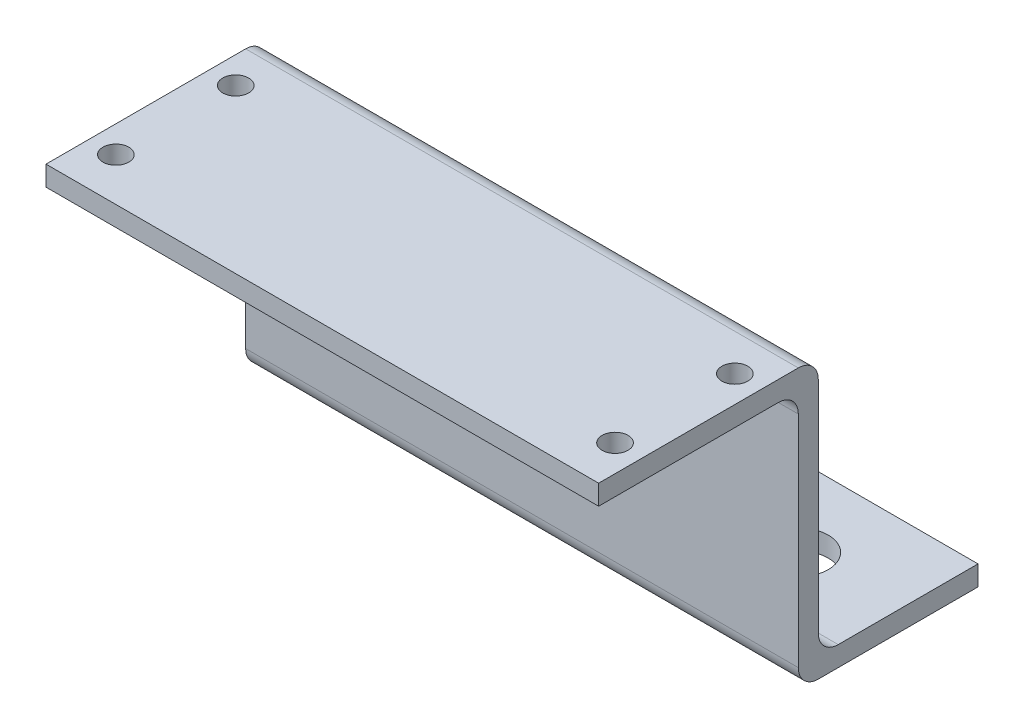
ISO-10303-21;
HEADER;
FILE_DESCRIPTION(('STEP AP214'),'2;1');
FILE_NAME('part.step','',(''),(''),'','','');
FILE_SCHEMA(('AUTOMOTIVE_DESIGN { 1 0 10303 214 1 1 1 1 }'));
ENDSEC;
DATA;
#1=APPLICATION_CONTEXT('core data for automotive mechanical design processes');
#2=APPLICATION_PROTOCOL_DEFINITION('international standard','automotive_design',2000,#1);
#3=PRODUCT_CONTEXT('',#1,'mechanical');
#4=PRODUCT('Part','Part','',(#3));
#5=PRODUCT_RELATED_PRODUCT_CATEGORY('part','',(#4));
#6=PRODUCT_DEFINITION_FORMATION('','',#4);
#7=PRODUCT_DEFINITION_CONTEXT('part definition',#1,'design');
#8=PRODUCT_DEFINITION('design','',#6,#7);
#9=PRODUCT_DEFINITION_SHAPE('','',#8);
#10=(LENGTH_UNIT() NAMED_UNIT(*) SI_UNIT(.MILLI.,.METRE.));
#11=(NAMED_UNIT(*) PLANE_ANGLE_UNIT() SI_UNIT($,.RADIAN.));
#12=(NAMED_UNIT(*) SI_UNIT($,.STERADIAN.) SOLID_ANGLE_UNIT());
#13=UNCERTAINTY_MEASURE_WITH_UNIT(LENGTH_MEASURE(1.E-05),#10,'distance_accuracy_value','');
#14=(GEOMETRIC_REPRESENTATION_CONTEXT(3) GLOBAL_UNCERTAINTY_ASSIGNED_CONTEXT((#13)) GLOBAL_UNIT_ASSIGNED_CONTEXT((#10,
#11,#12)) REPRESENTATION_CONTEXT('',''));
#15=CARTESIAN_POINT('',(0.,0.,0.));
#16=DIRECTION('',(0.,0.,1.));
#17=DIRECTION('',(1.,0.,0.));
#18=AXIS2_PLACEMENT_3D('',#15,#16,#17);
#19=CARTESIAN_POINT('',(-9.,14.,-11.6776695296523));
#20=DIRECTION('',(0.,0.,1.));
#21=DIRECTION('',(1.,0.,0.));
#22=AXIS2_PLACEMENT_3D('',#19,#20,#21);
#23=CYLINDRICAL_SURFACE('',#22,4.);
#24=CARTESIAN_POINT('',(-9.,14.,-7.67766952965229));
#25=DIRECTION('',(0.,0.,1.));
#26=DIRECTION('',(1.,0.,0.));
#27=AXIS2_PLACEMENT_3D('',#24,#25,#26);
#28=CIRCLE('',#27,4.);
#29=CARTESIAN_POINT('',(-5.,14.,-7.67766952965229));
#30=VERTEX_POINT('',#29);
#31=EDGE_CURVE('E182',#30,#30,#28,.T.);
#32=ORIENTED_EDGE('',*,*,#31,.T.);
#33=EDGE_LOOP('',(#32));
#34=FACE_BOUND('',#33,.T.);
#35=CARTESIAN_POINT('',(-9.,14.,-9.67766952965229));
#36=DIRECTION('',(0.,0.,-1.));
#37=DIRECTION('',(-1.,0.,0.));
#38=AXIS2_PLACEMENT_3D('',#35,#36,#37);
#39=CIRCLE('',#38,4.);
#40=CARTESIAN_POINT('',(-13.,14.,-9.67766952965229));
#41=VERTEX_POINT('',#40);
#42=EDGE_CURVE('E176',#41,#41,#39,.F.);
#43=ORIENTED_EDGE('',*,*,#42,.F.);
#44=EDGE_LOOP('',(#43));
#45=FACE_BOUND('',#44,.T.);
#46=ADVANCED_FACE('F43',(#34,#45),#23,.F.);
#47=CARTESIAN_POINT('',(9.,14.,-11.6776695296523));
#48=DIRECTION('',(0.,0.,1.));
#49=DIRECTION('',(1.,0.,0.));
#50=AXIS2_PLACEMENT_3D('',#47,#48,#49);
#51=CYLINDRICAL_SURFACE('',#50,4.);
#52=CARTESIAN_POINT('',(9.,14.,-7.67766952965229));
#53=DIRECTION('',(0.,0.,1.));
#54=DIRECTION('',(1.,0.,0.));
#55=AXIS2_PLACEMENT_3D('',#52,#53,#54);
#56=CIRCLE('',#55,4.);
#57=CARTESIAN_POINT('',(13.,14.,-7.67766952965229));
#58=VERTEX_POINT('',#57);
#59=EDGE_CURVE('E179',#58,#58,#56,.T.);
#60=ORIENTED_EDGE('',*,*,#59,.T.);
#61=EDGE_LOOP('',(#60));
#62=FACE_BOUND('',#61,.T.);
#63=CARTESIAN_POINT('',(9.,14.,-9.67766952965229));
#64=DIRECTION('',(0.,0.,-1.));
#65=DIRECTION('',(-1.,0.,0.));
#66=AXIS2_PLACEMENT_3D('',#63,#64,#65);
#67=CIRCLE('',#66,4.);
#68=CARTESIAN_POINT('',(5.,14.,-9.67766952965229));
#69=VERTEX_POINT('',#68);
#70=EDGE_CURVE('E175',#69,#69,#67,.T.);
#71=ORIENTED_EDGE('',*,*,#70,.T.);
#72=EDGE_LOOP('',(#71));
#73=FACE_BOUND('',#72,.T.);
#74=ADVANCED_FACE('F284',(#62,#73),#51,.F.);
#75=CARTESIAN_POINT('',(0.,2.,0.));
#76=DIRECTION('',(0.,-1.,0.));
#77=DIRECTION('',(0.,0.,-1.));
#78=AXIS2_PLACEMENT_3D('',#75,#76,#77);
#79=PLANE('',#78);
#80=DIRECTION('',(0.,0.,1.));
#81=VECTOR('',#80,1.);
#82=CARTESIAN_POINT('',(-27.6776695296838,2.,-9.67766952965229));
#83=LINE('',#82,#81);
#84=CARTESIAN_POINT('',(-27.6776695296838,2.,-25.6776695296523));
#85=VERTEX_POINT('',#84);
#86=CARTESIAN_POINT('',(-27.6776695296838,2.,-11.6776695296523));
#87=VERTEX_POINT('',#86);
#88=EDGE_CURVE('E206',#85,#87,#83,.T.);
#89=ORIENTED_EDGE('',*,*,#88,.T.);
#90=DIRECTION('',(1.,0.,0.));
#91=VECTOR('',#90,1.);
#92=CARTESIAN_POINT('',(0.,2.,-11.6776695296523));
#93=LINE('',#92,#91);
#94=CARTESIAN_POINT('',(27.6776695296893,2.,-11.6776695296523));
#95=VERTEX_POINT('',#94);
#96=EDGE_CURVE('E252',#87,#95,#93,.T.);
#97=ORIENTED_EDGE('',*,*,#96,.T.);
#98=DIRECTION('',(0.,0.,-1.));
#99=VECTOR('',#98,1.);
#100=CARTESIAN_POINT('',(27.6776695296893,2.,-25.6776695296523));
#101=LINE('',#100,#99);
#102=CARTESIAN_POINT('',(27.6776695296893,2.,-25.6776695296523));
#103=VERTEX_POINT('',#102);
#104=EDGE_CURVE('E210',#95,#103,#101,.T.);
#105=ORIENTED_EDGE('',*,*,#104,.T.);
#106=DIRECTION('',(-1.,0.,0.));
#107=VECTOR('',#106,1.);
#108=CARTESIAN_POINT('',(-27.6776695296838,2.,-25.6776695296523));
#109=LINE('',#108,#107);
#110=EDGE_CURVE('E203',#103,#85,#109,.T.);
#111=ORIENTED_EDGE('',*,*,#110,.T.);
#112=EDGE_LOOP('',(#89,#97,#105,#111));
#113=FACE_BOUND('',#112,.T.);
#114=CARTESIAN_POINT('',(-17.6776695296838,2.,-17.6776695296436));
#115=DIRECTION('',(0.,1.,0.));
#116=DIRECTION('',(0.,0.,1.));
#117=AXIS2_PLACEMENT_3D('',#114,#115,#116);
#118=CIRCLE('',#117,3.);
#119=CARTESIAN_POINT('',(-17.6776695296838,2.,-14.6776695296436));
#120=VERTEX_POINT('',#119);
#121=EDGE_CURVE('E197',#120,#120,#118,.T.);
#122=ORIENTED_EDGE('',*,*,#121,.F.);
#123=EDGE_LOOP('',(#122));
#124=FACE_BOUND('',#123,.T.);
#125=CARTESIAN_POINT('',(17.6776695296893,2.,-17.6776695296523));
#126=DIRECTION('',(0.,1.,0.));
#127=DIRECTION('',(0.,0.,1.));
#128=AXIS2_PLACEMENT_3D('',#125,#126,#127);
#129=CIRCLE('',#128,3.);
#130=CARTESIAN_POINT('',(17.6776695296893,2.,-14.6776695296523));
#131=VERTEX_POINT('',#130);
#132=EDGE_CURVE('E191',#131,#131,#129,.T.);
#133=ORIENTED_EDGE('',*,*,#132,.F.);
#134=EDGE_LOOP('',(#133));
#135=FACE_BOUND('',#134,.T.);
#136=ADVANCED_FACE('F257',(#113,#124,#135),#79,.F.);
#137=CARTESIAN_POINT('',(0.,0.,0.));
#138=DIRECTION('',(0.,-1.,0.));
#139=DIRECTION('',(0.,0.,-1.));
#140=AXIS2_PLACEMENT_3D('',#137,#138,#139);
#141=PLANE('',#140);
#142=CARTESIAN_POINT('',(-17.6776695296838,0.,-17.6776695296436));
#143=DIRECTION('',(0.,1.,0.));
#144=DIRECTION('',(0.,0.,1.));
#145=AXIS2_PLACEMENT_3D('',#142,#143,#144);
#146=CIRCLE('',#145,3.);
#147=CARTESIAN_POINT('',(-17.6776695296838,0.,-14.6776695296436));
#148=VERTEX_POINT('',#147);
#149=EDGE_CURVE('E194',#148,#148,#146,.T.);
#150=ORIENTED_EDGE('',*,*,#149,.T.);
#151=EDGE_LOOP('',(#150));
#152=FACE_BOUND('',#151,.T.);
#153=DIRECTION('',(0.,0.,-1.));
#154=VECTOR('',#153,1.);
#155=CARTESIAN_POINT('',(27.6776695296893,0.,-25.6776695296523));
#156=LINE('',#155,#154);
#157=CARTESIAN_POINT('',(27.6776695296893,0.,-9.67766952965229));
#158=VERTEX_POINT('',#157);
#159=CARTESIAN_POINT('',(27.6776695296893,0.,-25.6776695296523));
#160=VERTEX_POINT('',#159);
#161=EDGE_CURVE('E215',#158,#160,#156,.T.);
#162=ORIENTED_EDGE('',*,*,#161,.F.);
#163=DIRECTION('',(1.,0.,0.));
#164=VECTOR('',#163,1.);
#165=CARTESIAN_POINT('',(0.,0.,-9.67766952965229));
#166=LINE('',#165,#164);
#167=CARTESIAN_POINT('',(-27.6776695296838,0.,-9.67766952965229));
#168=VERTEX_POINT('',#167);
#169=EDGE_CURVE('E230',#158,#168,#166,.F.);
#170=ORIENTED_EDGE('',*,*,#169,.T.);
#171=DIRECTION('',(0.,0.,1.));
#172=VECTOR('',#171,1.);
#173=CARTESIAN_POINT('',(-27.6776695296838,0.,-9.67766952965229));
#174=LINE('',#173,#172);
#175=CARTESIAN_POINT('',(-27.6776695296838,0.,-25.6776695296523));
#176=VERTEX_POINT('',#175);
#177=EDGE_CURVE('E200',#176,#168,#174,.T.);
#178=ORIENTED_EDGE('',*,*,#177,.F.);
#179=DIRECTION('',(-1.,0.,0.));
#180=VECTOR('',#179,1.);
#181=CARTESIAN_POINT('',(17.6776695296893,0.,-25.6776695296523));
#182=LINE('',#181,#180);
#183=EDGE_CURVE('E207',#160,#176,#182,.T.);
#184=ORIENTED_EDGE('',*,*,#183,.F.);
#185=EDGE_LOOP('',(#162,#170,#178,#184));
#186=FACE_BOUND('',#185,.T.);
#187=CARTESIAN_POINT('',(17.6776695296893,0.,-17.6776695296523));
#188=DIRECTION('',(0.,1.,0.));
#189=DIRECTION('',(0.,0.,1.));
#190=AXIS2_PLACEMENT_3D('',#187,#188,#189);
#191=CIRCLE('',#190,3.);
#192=CARTESIAN_POINT('',(17.6776695296893,0.,-14.6776695296523));
#193=VERTEX_POINT('',#192);
#194=EDGE_CURVE('E190',#193,#193,#191,.T.);
#195=ORIENTED_EDGE('',*,*,#194,.T.);
#196=EDGE_LOOP('',(#195));
#197=FACE_BOUND('',#196,.T.);
#198=ADVANCED_FACE('F271',(#152,#186,#197),#141,.T.);
#199=CARTESIAN_POINT('',(-27.6776695296838,2.,-9.67766952965229));
#200=DIRECTION('',(1.,0.,0.));
#201=DIRECTION('',(0.,0.,-1.));
#202=AXIS2_PLACEMENT_3D('',#199,#200,#201);
#203=PLANE('',#202);
#204=DIRECTION('',(0.,0.,-1.));
#205=VECTOR('',#204,1.);
#206=CARTESIAN_POINT('',(-27.6776695296838,28.,12.3223304703477));
#207=LINE('',#206,#205);
#208=CARTESIAN_POINT('',(-27.6776695296838,28.,12.3223304703477));
#209=VERTEX_POINT('',#208);
#210=CARTESIAN_POINT('',(-27.6776695296838,28.,-7.67766952965229));
#211=VERTEX_POINT('',#210);
#212=EDGE_CURVE('E141',#209,#211,#207,.T.);
#213=ORIENTED_EDGE('',*,*,#212,.T.);
#214=CARTESIAN_POINT('',(-27.6776695296838,26.,-7.67766952965229));
#215=DIRECTION('',(1.,0.,0.));
#216=DIRECTION('',(0.,0.,-1.));
#217=AXIS2_PLACEMENT_3D('',#214,#215,#216);
#218=CIRCLE('',#217,2.);
#219=CARTESIAN_POINT('',(-27.6776695296838,26.,-9.67766952965229));
#220=VERTEX_POINT('',#219);
#221=EDGE_CURVE('E242',#211,#220,#218,.F.);
#222=ORIENTED_EDGE('',*,*,#221,.T.);
#223=DIRECTION('',(0.,-1.,0.));
#224=VECTOR('',#223,1.);
#225=CARTESIAN_POINT('',(-27.6776695296838,2.,-9.67766952965229));
#226=LINE('',#225,#224);
#227=CARTESIAN_POINT('',(-27.6776695296838,4.,-9.67766952965229));
#228=VERTEX_POINT('',#227);
#229=EDGE_CURVE('E167',#220,#228,#226,.T.);
#230=ORIENTED_EDGE('',*,*,#229,.T.);
#231=CARTESIAN_POINT('',(-27.6776695296838,4.,-11.6776695296523));
#232=DIRECTION('',(1.,0.,0.));
#233=DIRECTION('',(0.,0.,-1.));
#234=AXIS2_PLACEMENT_3D('',#231,#232,#233);
#235=CIRCLE('',#234,2.);
#236=EDGE_CURVE('E11',#228,#87,#235,.T.);
#237=ORIENTED_EDGE('',*,*,#236,.T.);
#238=ORIENTED_EDGE('',*,*,#88,.F.);
#239=DIRECTION('',(0.,-1.,0.));
#240=VECTOR('',#239,1.);
#241=CARTESIAN_POINT('',(-27.6776695296838,2.,-25.6776695296523));
#242=LINE('',#241,#240);
#243=EDGE_CURVE('E220',#85,#176,#242,.T.);
#244=ORIENTED_EDGE('',*,*,#243,.T.);
#245=ORIENTED_EDGE('',*,*,#177,.T.);
#246=CARTESIAN_POINT('',(-27.6776695296838,2.,-9.67766952965229));
#247=DIRECTION('',(1.,0.,0.));
#248=DIRECTION('',(0.,0.,-1.));
#249=AXIS2_PLACEMENT_3D('',#246,#247,#248);
#250=CIRCLE('',#249,2.);
#251=CARTESIAN_POINT('',(-27.6776695296838,2.,-7.67766952965229));
#252=VERTEX_POINT('',#251);
#253=EDGE_CURVE('E232',#168,#252,#250,.F.);
#254=ORIENTED_EDGE('',*,*,#253,.T.);
#255=DIRECTION('',(0.,-1.,0.));
#256=VECTOR('',#255,1.);
#257=CARTESIAN_POINT('',(-27.6776695296838,26.,-7.67766952965229));
#258=LINE('',#257,#256);
#259=CARTESIAN_POINT('',(-27.6776695296838,24.,-7.67766952965229));
#260=VERTEX_POINT('',#259);
#261=EDGE_CURVE('E185',#260,#252,#258,.T.);
#262=ORIENTED_EDGE('',*,*,#261,.F.);
#263=CARTESIAN_POINT('',(-27.6776695296838,24.,-5.67766952965229));
#264=DIRECTION('',(1.,0.,0.));
#265=DIRECTION('',(0.,0.,-1.));
#266=AXIS2_PLACEMENT_3D('',#263,#264,#265);
#267=CIRCLE('',#266,2.);
#268=CARTESIAN_POINT('',(-27.6776695296838,26.,-5.67766952965229));
#269=VERTEX_POINT('',#268);
#270=EDGE_CURVE('E137',#260,#269,#267,.T.);
#271=ORIENTED_EDGE('',*,*,#270,.T.);
#272=DIRECTION('',(0.,0.,-1.));
#273=VECTOR('',#272,1.);
#274=CARTESIAN_POINT('',(-27.6776695296838,26.,12.3223304703477));
#275=LINE('',#274,#273);
#276=CARTESIAN_POINT('',(-27.6776695296838,26.,12.3223304703477));
#277=VERTEX_POINT('',#276);
#278=EDGE_CURVE('E131',#277,#269,#275,.T.);
#279=ORIENTED_EDGE('',*,*,#278,.F.);
#280=DIRECTION('',(0.,1.,0.));
#281=VECTOR('',#280,1.);
#282=CARTESIAN_POINT('',(-27.6776695296838,26.,12.3223304703477));
#283=LINE('',#282,#281);
#284=EDGE_CURVE('E135',#277,#209,#283,.T.);
#285=ORIENTED_EDGE('',*,*,#284,.T.);
#286=EDGE_LOOP('',(#213,#222,#230,#237,#238,#244,#245,#254,#262,#271,#279,#285));
#287=FACE_BOUND('',#286,.T.);
#288=ADVANCED_FACE('F134',(#287),#203,.F.);
#289=CARTESIAN_POINT('',(27.6776695296893,2.,-25.6776695296523));
#290=DIRECTION('',(-1.,0.,0.));
#291=DIRECTION('',(0.,0.,1.));
#292=AXIS2_PLACEMENT_3D('',#289,#290,#291);
#293=PLANE('',#292);
#294=ORIENTED_EDGE('',*,*,#104,.F.);
#295=CARTESIAN_POINT('',(27.6776695296893,4.,-11.6776695296523));
#296=DIRECTION('',(-1.,0.,0.));
#297=DIRECTION('',(0.,0.,1.));
#298=AXIS2_PLACEMENT_3D('',#295,#296,#297);
#299=CIRCLE('',#298,2.);
#300=CARTESIAN_POINT('',(27.6776695296893,4.,-9.67766952965229));
#301=VERTEX_POINT('',#300);
#302=EDGE_CURVE('E51',#95,#301,#299,.T.);
#303=ORIENTED_EDGE('',*,*,#302,.T.);
#304=DIRECTION('',(0.,1.,0.));
#305=VECTOR('',#304,1.);
#306=CARTESIAN_POINT('',(27.6776695296893,26.,-9.67766952965229));
#307=LINE('',#306,#305);
#308=CARTESIAN_POINT('',(27.6776695296893,26.,-9.67766952965229));
#309=VERTEX_POINT('',#308);
#310=EDGE_CURVE('E173',#301,#309,#307,.T.);
#311=ORIENTED_EDGE('',*,*,#310,.T.);
#312=CARTESIAN_POINT('',(27.6776695296893,26.,-7.67766952965229));
#313=DIRECTION('',(-1.,0.,0.));
#314=DIRECTION('',(0.,0.,1.));
#315=AXIS2_PLACEMENT_3D('',#312,#313,#314);
#316=CIRCLE('',#315,2.);
#317=CARTESIAN_POINT('',(27.6776695296893,28.,-7.67766952965229));
#318=VERTEX_POINT('',#317);
#319=EDGE_CURVE('E238',#309,#318,#316,.F.);
#320=ORIENTED_EDGE('',*,*,#319,.T.);
#321=DIRECTION('',(0.,0.,-1.));
#322=VECTOR('',#321,1.);
#323=CARTESIAN_POINT('',(27.6776695296893,28.,12.3223304703477));
#324=LINE('',#323,#322);
#325=CARTESIAN_POINT('',(27.6776695296893,28.,12.3223304703477));
#326=VERTEX_POINT('',#325);
#327=EDGE_CURVE('E168',#326,#318,#324,.T.);
#328=ORIENTED_EDGE('',*,*,#327,.F.);
#329=DIRECTION('',(0.,-1.,0.));
#330=VECTOR('',#329,1.);
#331=CARTESIAN_POINT('',(27.6776695296893,26.,12.3223304703477));
#332=LINE('',#331,#330);
#333=CARTESIAN_POINT('',(27.6776695296893,26.,12.3223304703477));
#334=VERTEX_POINT('',#333);
#335=EDGE_CURVE('E142',#326,#334,#332,.T.);
#336=ORIENTED_EDGE('',*,*,#335,.T.);
#337=DIRECTION('',(0.,0.,-1.));
#338=VECTOR('',#337,1.);
#339=CARTESIAN_POINT('',(27.6776695296893,26.,12.3223304703477));
#340=LINE('',#339,#338);
#341=CARTESIAN_POINT('',(27.6776695296893,26.,-5.67766952965229));
#342=VERTEX_POINT('',#341);
#343=EDGE_CURVE('E156',#334,#342,#340,.T.);
#344=ORIENTED_EDGE('',*,*,#343,.T.);
#345=CARTESIAN_POINT('',(27.6776695296893,24.,-5.67766952965229));
#346=DIRECTION('',(-1.,0.,0.));
#347=DIRECTION('',(0.,0.,1.));
#348=AXIS2_PLACEMENT_3D('',#345,#346,#347);
#349=CIRCLE('',#348,2.);
#350=CARTESIAN_POINT('',(27.6776695296893,24.,-7.67766952965229));
#351=VERTEX_POINT('',#350);
#352=EDGE_CURVE('E250',#342,#351,#349,.T.);
#353=ORIENTED_EDGE('',*,*,#352,.T.);
#354=DIRECTION('',(0.,1.,0.));
#355=VECTOR('',#354,1.);
#356=CARTESIAN_POINT('',(27.6776695296893,26.,-7.67766952965229));
#357=LINE('',#356,#355);
#358=CARTESIAN_POINT('',(27.6776695296893,2.,-7.67766952965229));
#359=VERTEX_POINT('',#358);
#360=EDGE_CURVE('E187',#359,#351,#357,.T.);
#361=ORIENTED_EDGE('',*,*,#360,.F.);
#362=CARTESIAN_POINT('',(27.6776695296893,2.,-9.67766952965229));
#363=DIRECTION('',(-1.,0.,0.));
#364=DIRECTION('',(0.,0.,1.));
#365=AXIS2_PLACEMENT_3D('',#362,#363,#364);
#366=CIRCLE('',#365,2.);
#367=EDGE_CURVE('E228',#359,#158,#366,.F.);
#368=ORIENTED_EDGE('',*,*,#367,.T.);
#369=ORIENTED_EDGE('',*,*,#161,.T.);
#370=DIRECTION('',(0.,-1.,0.));
#371=VECTOR('',#370,1.);
#372=CARTESIAN_POINT('',(27.6776695296893,2.,-25.6776695296523));
#373=LINE('',#372,#371);
#374=EDGE_CURVE('E212',#103,#160,#373,.T.);
#375=ORIENTED_EDGE('',*,*,#374,.F.);
#376=EDGE_LOOP('',(#294,#303,#311,#320,#328,#336,#344,#353,#361,#368,#369,#375));
#377=FACE_BOUND('',#376,.T.);
#378=ADVANCED_FACE('F263',(#377),#293,.F.);
#379=CARTESIAN_POINT('',(17.6776695296893,2.,-25.6776695296523));
#380=DIRECTION('',(0.,0.,1.));
#381=DIRECTION('',(1.,0.,0.));
#382=AXIS2_PLACEMENT_3D('',#379,#380,#381);
#383=PLANE('',#382);
#384=ORIENTED_EDGE('',*,*,#183,.T.);
#385=ORIENTED_EDGE('',*,*,#243,.F.);
#386=ORIENTED_EDGE('',*,*,#110,.F.);
#387=ORIENTED_EDGE('',*,*,#374,.T.);
#388=EDGE_LOOP('',(#384,#385,#386,#387));
#389=FACE_BOUND('',#388,.T.);
#390=ADVANCED_FACE('F267',(#389),#383,.F.);
#391=CARTESIAN_POINT('',(-17.6776695296838,2.,-17.6776695296436));
#392=DIRECTION('',(0.,-1.,0.));
#393=DIRECTION('',(0.,0.,-1.));
#394=AXIS2_PLACEMENT_3D('',#391,#392,#393);
#395=CYLINDRICAL_SURFACE('',#394,3.);
#396=ORIENTED_EDGE('',*,*,#121,.T.);
#397=EDGE_LOOP('',(#396));
#398=FACE_BOUND('',#397,.T.);
#399=ORIENTED_EDGE('',*,*,#149,.F.);
#400=EDGE_LOOP('',(#399));
#401=FACE_BOUND('',#400,.T.);
#402=ADVANCED_FACE('F299',(#398,#401),#395,.F.);
#403=CARTESIAN_POINT('',(17.6776695296893,2.,-17.6776695296523));
#404=DIRECTION('',(0.,-1.,0.));
#405=DIRECTION('',(0.,0.,-1.));
#406=AXIS2_PLACEMENT_3D('',#403,#404,#405);
#407=CYLINDRICAL_SURFACE('',#406,3.);
#408=ORIENTED_EDGE('',*,*,#132,.T.);
#409=EDGE_LOOP('',(#408));
#410=FACE_BOUND('',#409,.T.);
#411=ORIENTED_EDGE('',*,*,#194,.F.);
#412=EDGE_LOOP('',(#411));
#413=FACE_BOUND('',#412,.T.);
#414=ADVANCED_FACE('F296',(#410,#413),#407,.F.);
#415=CARTESIAN_POINT('',(0.,0.,-7.67766952965229));
#416=DIRECTION('',(0.,0.,1.));
#417=DIRECTION('',(1.,0.,0.));
#418=AXIS2_PLACEMENT_3D('',#415,#416,#417);
#419=PLANE('',#418);
#420=ORIENTED_EDGE('',*,*,#31,.F.);
#421=EDGE_LOOP('',(#420));
#422=FACE_BOUND('',#421,.T.);
#423=ORIENTED_EDGE('',*,*,#360,.T.);
#424=DIRECTION('',(-1.,0.,0.));
#425=VECTOR('',#424,1.);
#426=CARTESIAN_POINT('',(-27.6776695296838,24.,-7.67766952965229));
#427=LINE('',#426,#425);
#428=EDGE_CURVE('E244',#351,#260,#427,.T.);
#429=ORIENTED_EDGE('',*,*,#428,.T.);
#430=ORIENTED_EDGE('',*,*,#261,.T.);
#431=DIRECTION('',(1.,0.,0.));
#432=VECTOR('',#431,1.);
#433=CARTESIAN_POINT('',(0.,2.,-7.67766952965229));
#434=LINE('',#433,#432);
#435=EDGE_CURVE('E223',#252,#359,#434,.T.);
#436=ORIENTED_EDGE('',*,*,#435,.T.);
#437=EDGE_LOOP('',(#423,#429,#430,#436));
#438=FACE_BOUND('',#437,.T.);
#439=ORIENTED_EDGE('',*,*,#59,.F.);
#440=EDGE_LOOP('',(#439));
#441=FACE_BOUND('',#440,.T.);
#442=ADVANCED_FACE('F298',(#422,#438,#441),#419,.T.);
#443=CARTESIAN_POINT('',(0.,0.,-9.67766952965229));
#444=DIRECTION('',(0.,0.,-1.));
#445=DIRECTION('',(-1.,0.,0.));
#446=AXIS2_PLACEMENT_3D('',#443,#444,#445);
#447=PLANE('',#446);
#448=ORIENTED_EDGE('',*,*,#70,.F.);
#449=EDGE_LOOP('',(#448));
#450=FACE_BOUND('',#449,.T.);
#451=ORIENTED_EDGE('',*,*,#310,.F.);
#452=DIRECTION('',(1.,0.,0.));
#453=VECTOR('',#452,1.);
#454=CARTESIAN_POINT('',(0.,4.,-9.67766952965229));
#455=LINE('',#454,#453);
#456=EDGE_CURVE('E64',#301,#228,#455,.F.);
#457=ORIENTED_EDGE('',*,*,#456,.T.);
#458=ORIENTED_EDGE('',*,*,#229,.F.);
#459=DIRECTION('',(1.,0.,0.));
#460=VECTOR('',#459,1.);
#461=CARTESIAN_POINT('',(0.,26.,-9.67766952965229));
#462=LINE('',#461,#460);
#463=EDGE_CURVE('E235',#220,#309,#462,.T.);
#464=ORIENTED_EDGE('',*,*,#463,.T.);
#465=EDGE_LOOP('',(#451,#457,#458,#464));
#466=FACE_BOUND('',#465,.T.);
#467=ORIENTED_EDGE('',*,*,#42,.T.);
#468=EDGE_LOOP('',(#467));
#469=FACE_BOUND('',#468,.T.);
#470=ADVANCED_FACE('F318',(#450,#466,#469),#447,.T.);
#471=CARTESIAN_POINT('',(0.,2.,-9.67766952965229));
#472=DIRECTION('',(1.,0.,0.));
#473=DIRECTION('',(0.,0.,-1.));
#474=AXIS2_PLACEMENT_3D('',#471,#472,#473);
#475=CYLINDRICAL_SURFACE('',#474,2.);
#476=ORIENTED_EDGE('',*,*,#253,.F.);
#477=ORIENTED_EDGE('',*,*,#169,.F.);
#478=ORIENTED_EDGE('',*,*,#367,.F.);
#479=ORIENTED_EDGE('',*,*,#435,.F.);
#480=EDGE_LOOP('',(#476,#477,#478,#479));
#481=FACE_BOUND('',#480,.T.);
#482=ADVANCED_FACE('F315',(#481),#475,.T.);
#483=CARTESIAN_POINT('',(27.6776695296893,26.,12.3223304703477));
#484=DIRECTION('',(0.,-1.,0.));
#485=DIRECTION('',(0.,0.,-1.));
#486=AXIS2_PLACEMENT_3D('',#483,#484,#485);
#487=PLANE('',#486);
#488=CARTESIAN_POINT('',(-25.,26.,8.));
#489=DIRECTION('',(0.,-1.,0.));
#490=DIRECTION('',(0.,0.,-1.));
#491=AXIS2_PLACEMENT_3D('',#488,#489,#490);
#492=CIRCLE('',#491,1.3);
#493=CARTESIAN_POINT('',(-25.,26.,6.7));
#494=VERTEX_POINT('',#493);
#495=EDGE_CURVE('E157',#494,#494,#492,.T.);
#496=ORIENTED_EDGE('',*,*,#495,.F.);
#497=EDGE_LOOP('',(#496));
#498=FACE_BOUND('',#497,.T.);
#499=CARTESIAN_POINT('',(-25.,26.,-4.00000000000001));
#500=DIRECTION('',(0.,-1.,0.));
#501=DIRECTION('',(0.,0.,-1.));
#502=AXIS2_PLACEMENT_3D('',#499,#500,#501);
#503=CIRCLE('',#502,1.3);
#504=CARTESIAN_POINT('',(-25.,26.,-5.3));
#505=VERTEX_POINT('',#504);
#506=EDGE_CURVE('E160',#505,#505,#503,.T.);
#507=ORIENTED_EDGE('',*,*,#506,.F.);
#508=EDGE_LOOP('',(#507));
#509=FACE_BOUND('',#508,.T.);
#510=CARTESIAN_POINT('',(25.,26.,-4.00000000000001));
#511=DIRECTION('',(0.,-1.,0.));
#512=DIRECTION('',(0.,0.,-1.));
#513=AXIS2_PLACEMENT_3D('',#510,#511,#512);
#514=CIRCLE('',#513,1.3);
#515=CARTESIAN_POINT('',(25.,26.,-5.3));
#516=VERTEX_POINT('',#515);
#517=EDGE_CURVE('E375',#516,#516,#514,.T.);
#518=ORIENTED_EDGE('',*,*,#517,.F.);
#519=EDGE_LOOP('',(#518));
#520=FACE_BOUND('',#519,.T.);
#521=CARTESIAN_POINT('',(25.,26.,7.99999999999999));
#522=DIRECTION('',(0.,-1.,0.));
#523=DIRECTION('',(0.,0.,-1.));
#524=AXIS2_PLACEMENT_3D('',#521,#522,#523);
#525=CIRCLE('',#524,1.3);
#526=CARTESIAN_POINT('',(25.,26.,6.7));
#527=VERTEX_POINT('',#526);
#528=EDGE_CURVE('E384',#527,#527,#525,.T.);
#529=ORIENTED_EDGE('',*,*,#528,.F.);
#530=EDGE_LOOP('',(#529));
#531=FACE_BOUND('',#530,.T.);
#532=ORIENTED_EDGE('',*,*,#278,.T.);
#533=DIRECTION('',(-1.,0.,0.));
#534=VECTOR('',#533,1.);
#535=CARTESIAN_POINT('',(27.6776695296893,26.,-5.67766952965229));
#536=LINE('',#535,#534);
#537=EDGE_CURVE('E247',#269,#342,#536,.F.);
#538=ORIENTED_EDGE('',*,*,#537,.T.);
#539=ORIENTED_EDGE('',*,*,#343,.F.);
#540=DIRECTION('',(-1.,0.,0.));
#541=VECTOR('',#540,1.);
#542=CARTESIAN_POINT('',(27.6776695296893,26.,12.3223304703477));
#543=LINE('',#542,#541);
#544=EDGE_CURVE('E149',#334,#277,#543,.T.);
#545=ORIENTED_EDGE('',*,*,#544,.T.);
#546=EDGE_LOOP('',(#532,#538,#539,#545));
#547=FACE_BOUND('',#546,.T.);
#548=ADVANCED_FACE('F154',(#498,#509,#520,#531,#547),#487,.T.);
#549=CARTESIAN_POINT('',(-27.6776695296838,28.,12.3223304703477));
#550=DIRECTION('',(0.,1.,0.));
#551=DIRECTION('',(0.,0.,1.));
#552=AXIS2_PLACEMENT_3D('',#549,#550,#551);
#553=PLANE('',#552);
#554=CARTESIAN_POINT('',(-25.,28.,8.));
#555=DIRECTION('',(0.,1.,0.));
#556=DIRECTION('',(0.,0.,-1.));
#557=AXIS2_PLACEMENT_3D('',#554,#555,#556);
#558=CIRCLE('',#557,1.3);
#559=CARTESIAN_POINT('',(-25.,28.,6.7));
#560=VERTEX_POINT('',#559);
#561=EDGE_CURVE('E387',#560,#560,#558,.T.);
#562=ORIENTED_EDGE('',*,*,#561,.F.);
#563=EDGE_LOOP('',(#562));
#564=FACE_BOUND('',#563,.T.);
#565=CARTESIAN_POINT('',(-25.,28.,-4.00000000000001));
#566=DIRECTION('',(0.,1.,0.));
#567=DIRECTION('',(0.,0.,-1.));
#568=AXIS2_PLACEMENT_3D('',#565,#566,#567);
#569=CIRCLE('',#568,1.3);
#570=CARTESIAN_POINT('',(-25.,28.,-5.3));
#571=VERTEX_POINT('',#570);
#572=EDGE_CURVE('E381',#571,#571,#569,.T.);
#573=ORIENTED_EDGE('',*,*,#572,.F.);
#574=EDGE_LOOP('',(#573));
#575=FACE_BOUND('',#574,.T.);
#576=CARTESIAN_POINT('',(25.,28.,-4.00000000000001));
#577=DIRECTION('',(0.,1.,0.));
#578=DIRECTION('',(0.,0.,1.));
#579=AXIS2_PLACEMENT_3D('',#576,#577,#578);
#580=CIRCLE('',#579,1.3);
#581=CARTESIAN_POINT('',(25.,28.,-2.70000000000001));
#582=VERTEX_POINT('',#581);
#583=EDGE_CURVE('E378',#582,#582,#580,.T.);
#584=ORIENTED_EDGE('',*,*,#583,.F.);
#585=EDGE_LOOP('',(#584));
#586=FACE_BOUND('',#585,.T.);
#587=CARTESIAN_POINT('',(25.,28.,7.99999999999999));
#588=DIRECTION('',(0.,1.,0.));
#589=DIRECTION('',(0.,0.,1.));
#590=AXIS2_PLACEMENT_3D('',#587,#588,#589);
#591=CIRCLE('',#590,1.3);
#592=CARTESIAN_POINT('',(25.,28.,9.29999999999999));
#593=VERTEX_POINT('',#592);
#594=EDGE_CURVE('E380',#593,#593,#591,.T.);
#595=ORIENTED_EDGE('',*,*,#594,.F.);
#596=EDGE_LOOP('',(#595));
#597=FACE_BOUND('',#596,.T.);
#598=ORIENTED_EDGE('',*,*,#327,.T.);
#599=DIRECTION('',(1.,0.,0.));
#600=VECTOR('',#599,1.);
#601=CARTESIAN_POINT('',(-27.6776695296838,28.,-7.67766952965229));
#602=LINE('',#601,#600);
#603=EDGE_CURVE('E240',#318,#211,#602,.F.);
#604=ORIENTED_EDGE('',*,*,#603,.T.);
#605=ORIENTED_EDGE('',*,*,#212,.F.);
#606=DIRECTION('',(1.,0.,0.));
#607=VECTOR('',#606,1.);
#608=CARTESIAN_POINT('',(-27.6776695296838,28.,12.3223304703477));
#609=LINE('',#608,#607);
#610=EDGE_CURVE('E152',#209,#326,#609,.T.);
#611=ORIENTED_EDGE('',*,*,#610,.T.);
#612=EDGE_LOOP('',(#598,#604,#605,#611));
#613=FACE_BOUND('',#612,.T.);
#614=ADVANCED_FACE('F337',(#564,#575,#586,#597,#613),#553,.T.);
#615=CARTESIAN_POINT('',(0.,0.,12.3223304703477));
#616=DIRECTION('',(0.,0.,-1.));
#617=DIRECTION('',(-1.,0.,0.));
#618=AXIS2_PLACEMENT_3D('',#615,#616,#617);
#619=PLANE('',#618);
#620=ORIENTED_EDGE('',*,*,#544,.F.);
#621=ORIENTED_EDGE('',*,*,#335,.F.);
#622=ORIENTED_EDGE('',*,*,#610,.F.);
#623=ORIENTED_EDGE('',*,*,#284,.F.);
#624=EDGE_LOOP('',(#620,#621,#622,#623));
#625=FACE_BOUND('',#624,.T.);
#626=ADVANCED_FACE('F147',(#625),#619,.F.);
#627=CARTESIAN_POINT('',(25.,5.99999999999999,7.99999999999999));
#628=DIRECTION('',(0.,1.,0.));
#629=DIRECTION('',(0.,0.,1.));
#630=AXIS2_PLACEMENT_3D('',#627,#628,#629);
#631=CYLINDRICAL_SURFACE('',#630,1.3);
#632=ORIENTED_EDGE('',*,*,#528,.T.);
#633=EDGE_LOOP('',(#632));
#634=FACE_BOUND('',#633,.T.);
#635=ORIENTED_EDGE('',*,*,#594,.T.);
#636=EDGE_LOOP('',(#635));
#637=FACE_BOUND('',#636,.T.);
#638=ADVANCED_FACE('F360',(#634,#637),#631,.F.);
#639=CARTESIAN_POINT('',(25.,5.99999999999999,-4.00000000000001));
#640=DIRECTION('',(0.,1.,0.));
#641=DIRECTION('',(0.,0.,1.));
#642=AXIS2_PLACEMENT_3D('',#639,#640,#641);
#643=CYLINDRICAL_SURFACE('',#642,1.3);
#644=ORIENTED_EDGE('',*,*,#517,.T.);
#645=EDGE_LOOP('',(#644));
#646=FACE_BOUND('',#645,.T.);
#647=ORIENTED_EDGE('',*,*,#583,.T.);
#648=EDGE_LOOP('',(#647));
#649=FACE_BOUND('',#648,.T.);
#650=ADVANCED_FACE('F362',(#646,#649),#643,.F.);
#651=CARTESIAN_POINT('',(-25.,5.99999999999999,-4.00000000000001));
#652=DIRECTION('',(0.,1.,0.));
#653=DIRECTION('',(0.,0.,1.));
#654=AXIS2_PLACEMENT_3D('',#651,#652,#653);
#655=CYLINDRICAL_SURFACE('',#654,1.3);
#656=ORIENTED_EDGE('',*,*,#506,.T.);
#657=EDGE_LOOP('',(#656));
#658=FACE_BOUND('',#657,.T.);
#659=ORIENTED_EDGE('',*,*,#572,.T.);
#660=EDGE_LOOP('',(#659));
#661=FACE_BOUND('',#660,.T.);
#662=ADVANCED_FACE('F328',(#658,#661),#655,.F.);
#663=CARTESIAN_POINT('',(-25.,5.99999999999999,8.));
#664=DIRECTION('',(0.,1.,0.));
#665=DIRECTION('',(0.,0.,1.));
#666=AXIS2_PLACEMENT_3D('',#663,#664,#665);
#667=CYLINDRICAL_SURFACE('',#666,1.3);
#668=ORIENTED_EDGE('',*,*,#495,.T.);
#669=EDGE_LOOP('',(#668));
#670=FACE_BOUND('',#669,.T.);
#671=ORIENTED_EDGE('',*,*,#561,.T.);
#672=EDGE_LOOP('',(#671));
#673=FACE_BOUND('',#672,.T.);
#674=ADVANCED_FACE('F321',(#670,#673),#667,.F.);
#675=CARTESIAN_POINT('',(0.,26.,-7.67766952965229));
#676=DIRECTION('',(1.,0.,0.));
#677=DIRECTION('',(0.,0.,-1.));
#678=AXIS2_PLACEMENT_3D('',#675,#676,#677);
#679=CYLINDRICAL_SURFACE('',#678,2.);
#680=ORIENTED_EDGE('',*,*,#221,.F.);
#681=ORIENTED_EDGE('',*,*,#603,.F.);
#682=ORIENTED_EDGE('',*,*,#319,.F.);
#683=ORIENTED_EDGE('',*,*,#463,.F.);
#684=EDGE_LOOP('',(#680,#681,#682,#683));
#685=FACE_BOUND('',#684,.T.);
#686=ADVANCED_FACE('F281',(#685),#679,.T.);
#687=CARTESIAN_POINT('',(0.,24.,-5.67766952965229));
#688=DIRECTION('',(1.,0.,0.));
#689=DIRECTION('',(0.,0.,-1.));
#690=AXIS2_PLACEMENT_3D('',#687,#688,#689);
#691=CYLINDRICAL_SURFACE('',#690,2.);
#692=ORIENTED_EDGE('',*,*,#352,.F.);
#693=ORIENTED_EDGE('',*,*,#537,.F.);
#694=ORIENTED_EDGE('',*,*,#270,.F.);
#695=ORIENTED_EDGE('',*,*,#428,.F.);
#696=EDGE_LOOP('',(#692,#693,#694,#695));
#697=FACE_BOUND('',#696,.T.);
#698=ADVANCED_FACE('F276',(#697),#691,.F.);
#699=CARTESIAN_POINT('',(0.,4.,-11.6776695296523));
#700=DIRECTION('',(1.,0.,0.));
#701=DIRECTION('',(0.,0.,-1.));
#702=AXIS2_PLACEMENT_3D('',#699,#700,#701);
#703=CYLINDRICAL_SURFACE('',#702,2.);
#704=ORIENTED_EDGE('',*,*,#236,.F.);
#705=ORIENTED_EDGE('',*,*,#456,.F.);
#706=ORIENTED_EDGE('',*,*,#302,.F.);
#707=ORIENTED_EDGE('',*,*,#96,.F.);
#708=EDGE_LOOP('',(#704,#705,#706,#707));
#709=FACE_BOUND('',#708,.T.);
#710=ADVANCED_FACE('F45',(#709),#703,.F.);
#711=CLOSED_SHELL('',(#46,#74,#136,#198,#288,#378,#390,#402,#414,#442,#470,#482,#548,#614,#626,
#638,#650,#662,#674,#686,#698,#710));
#712=MANIFOLD_SOLID_BREP('B2',#711);
#713=ADVANCED_BREP_SHAPE_REPRESENTATION('',(#18,#712),#14);
#714=SHAPE_DEFINITION_REPRESENTATION(#9,#713);
ENDSEC;
END-ISO-10303-21;
